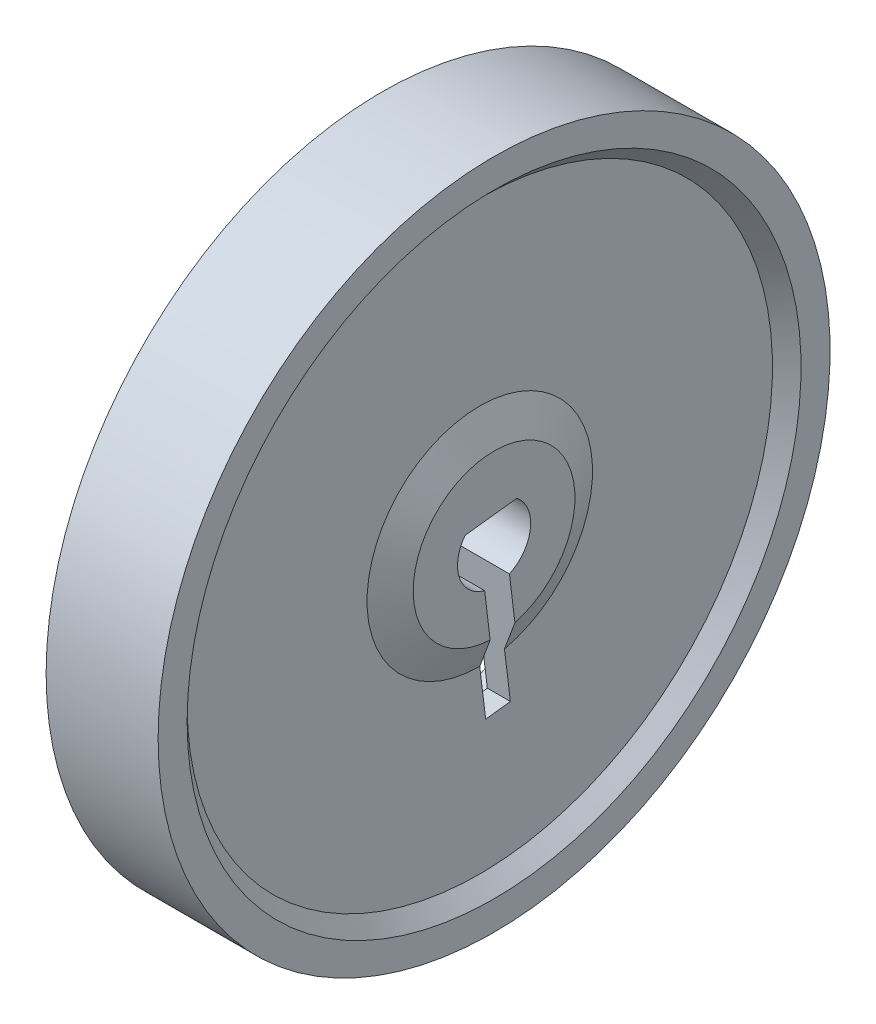
ISO-10303-21;
HEADER;
FILE_DESCRIPTION(('STEP AP214'),'2;1');
FILE_NAME('part.step','',(''),(''),'','','');
FILE_SCHEMA(('AUTOMOTIVE_DESIGN { 1 0 10303 214 1 1 1 1 }'));
ENDSEC;
DATA;
#1=APPLICATION_CONTEXT('core data for automotive mechanical design processes');
#2=APPLICATION_PROTOCOL_DEFINITION('international standard','automotive_design',2000,#1);
#3=PRODUCT_CONTEXT('',#1,'mechanical');
#4=PRODUCT('Part','Part','',(#3));
#5=PRODUCT_RELATED_PRODUCT_CATEGORY('part','',(#4));
#6=PRODUCT_DEFINITION_FORMATION('','',#4);
#7=PRODUCT_DEFINITION_CONTEXT('part definition',#1,'design');
#8=PRODUCT_DEFINITION('design','',#6,#7);
#9=PRODUCT_DEFINITION_SHAPE('','',#8);
#10=(LENGTH_UNIT() NAMED_UNIT(*) SI_UNIT(.MILLI.,.METRE.));
#11=(NAMED_UNIT(*) PLANE_ANGLE_UNIT() SI_UNIT($,.RADIAN.));
#12=(NAMED_UNIT(*) SI_UNIT($,.STERADIAN.) SOLID_ANGLE_UNIT());
#13=UNCERTAINTY_MEASURE_WITH_UNIT(LENGTH_MEASURE(1.E-05),#10,'distance_accuracy_value','');
#14=(GEOMETRIC_REPRESENTATION_CONTEXT(3) GLOBAL_UNCERTAINTY_ASSIGNED_CONTEXT((#13)) GLOBAL_UNIT_ASSIGNED_CONTEXT((#10,
#11,#12)) REPRESENTATION_CONTEXT('',''));
#15=CARTESIAN_POINT('',(0.,0.,0.));
#16=DIRECTION('',(0.,0.,1.));
#17=DIRECTION('',(1.,0.,0.));
#18=AXIS2_PLACEMENT_3D('',#15,#16,#17);
#19=CARTESIAN_POINT('',(-0.574918786767848,0.,0.));
#20=DIRECTION('',(1.,0.,0.));
#21=DIRECTION('',(0.,0.,-1.));
#22=AXIS2_PLACEMENT_3D('',#19,#20,#21);
#23=CONICAL_SURFACE('',#22,11.7591738452205,0.785398163397457);
#24=CARTESIAN_POINT('',(0.,0.,0.));
#25=DIRECTION('',(-1.,0.,0.));
#26=DIRECTION('',(0.,0.,1.));
#27=AXIS2_PLACEMENT_3D('',#24,#25,#26);
#28=CIRCLE('',#27,12.3340926319884);
#29=CARTESIAN_POINT('',(0.,0.,12.3340926319884));
#30=VERTEX_POINT('',#29);
#31=EDGE_CURVE('E196',#30,#30,#28,.T.);
#32=ORIENTED_EDGE('',*,*,#31,.F.);
#33=EDGE_LOOP('',(#32));
#34=FACE_BOUND('',#33,.T.);
#35=CARTESIAN_POINT('',(-0.574918786767848,0.,0.));
#36=DIRECTION('',(-1.,0.,0.));
#37=DIRECTION('',(0.,0.,1.));
#38=AXIS2_PLACEMENT_3D('',#35,#36,#37);
#39=CIRCLE('',#38,11.7591738452205);
#40=CARTESIAN_POINT('',(-0.574918786767848,0.,11.7591738452205));
#41=VERTEX_POINT('',#40);
#42=EDGE_CURVE('E198',#41,#41,#39,.T.);
#43=ORIENTED_EDGE('',*,*,#42,.T.);
#44=EDGE_LOOP('',(#43));
#45=FACE_BOUND('',#44,.T.);
#46=ADVANCED_FACE('F34',(#34,#45),#23,.F.);
#47=CARTESIAN_POINT('',(0.,12.3340926319884,0.));
#48=DIRECTION('',(-1.,0.,0.));
#49=DIRECTION('',(0.,0.,1.));
#50=AXIS2_PLACEMENT_3D('',#47,#48,#49);
#51=PLANE('',#50);
#52=CARTESIAN_POINT('',(0.,0.,0.));
#53=DIRECTION('',(-1.,0.,0.));
#54=DIRECTION('',(0.,0.,1.));
#55=AXIS2_PLACEMENT_3D('',#52,#53,#54);
#56=CIRCLE('',#55,13.5);
#57=CARTESIAN_POINT('',(0.,0.,13.5));
#58=VERTEX_POINT('',#57);
#59=EDGE_CURVE('E226',#58,#58,#56,.T.);
#60=ORIENTED_EDGE('',*,*,#59,.F.);
#61=EDGE_LOOP('',(#60));
#62=FACE_BOUND('',#61,.T.);
#63=ORIENTED_EDGE('',*,*,#31,.T.);
#64=EDGE_LOOP('',(#63));
#65=FACE_BOUND('',#64,.T.);
#66=ADVANCED_FACE('F186',(#62,#65),#51,.F.);
#67=CARTESIAN_POINT('',(-7.,0.,0.));
#68=DIRECTION('',(-1.,0.,0.));
#69=DIRECTION('',(0.,0.,1.));
#70=AXIS2_PLACEMENT_3D('',#67,#68,#69);
#71=CYLINDRICAL_SURFACE('',#70,13.5);
#72=CARTESIAN_POINT('',(-4.5,0.,0.));
#73=DIRECTION('',(-1.,0.,0.));
#74=DIRECTION('',(0.,0.,1.));
#75=AXIS2_PLACEMENT_3D('',#72,#73,#74);
#76=CIRCLE('',#75,13.5);
#77=CARTESIAN_POINT('',(-4.5,0.,13.5));
#78=VERTEX_POINT('',#77);
#79=EDGE_CURVE('E223',#78,#78,#76,.T.);
#80=ORIENTED_EDGE('',*,*,#79,.F.);
#81=EDGE_LOOP('',(#80));
#82=FACE_BOUND('',#81,.T.);
#83=ORIENTED_EDGE('',*,*,#59,.T.);
#84=EDGE_LOOP('',(#83));
#85=FACE_BOUND('',#84,.T.);
#86=ADVANCED_FACE('F191',(#82,#85),#71,.T.);
#87=CARTESIAN_POINT('',(-4.5,13.5,0.));
#88=DIRECTION('',(1.,0.,0.));
#89=DIRECTION('',(0.,0.,-1.));
#90=AXIS2_PLACEMENT_3D('',#87,#88,#89);
#91=PLANE('',#90);
#92=CARTESIAN_POINT('',(-4.5,0.,0.));
#93=DIRECTION('',(-1.,0.,0.));
#94=DIRECTION('',(0.,0.,1.));
#95=AXIS2_PLACEMENT_3D('',#92,#93,#94);
#96=CIRCLE('',#95,9.58354968555852);
#97=CARTESIAN_POINT('',(-4.5,0.,9.58354968555852));
#98=VERTEX_POINT('',#97);
#99=EDGE_CURVE('E220',#98,#98,#96,.T.);
#100=ORIENTED_EDGE('',*,*,#99,.F.);
#101=EDGE_LOOP('',(#100));
#102=FACE_BOUND('',#101,.T.);
#103=ORIENTED_EDGE('',*,*,#79,.T.);
#104=EDGE_LOOP('',(#103));
#105=FACE_BOUND('',#104,.T.);
#106=ADVANCED_FACE('F361',(#102,#105),#91,.F.);
#107=CARTESIAN_POINT('',(-7.,0.,0.));
#108=DIRECTION('',(-1.,0.,0.));
#109=DIRECTION('',(0.,0.,1.));
#110=AXIS2_PLACEMENT_3D('',#107,#108,#109);
#111=CYLINDRICAL_SURFACE('',#110,9.58354968555852);
#112=CARTESIAN_POINT('',(-1.5,0.,0.));
#113=DIRECTION('',(-1.,0.,0.));
#114=DIRECTION('',(0.,0.,1.));
#115=AXIS2_PLACEMENT_3D('',#112,#113,#114);
#116=CIRCLE('',#115,9.58354968555852);
#117=CARTESIAN_POINT('',(-1.5,0.,9.58354968555852));
#118=VERTEX_POINT('',#117);
#119=EDGE_CURVE('E217',#118,#118,#116,.T.);
#120=ORIENTED_EDGE('',*,*,#119,.F.);
#121=EDGE_LOOP('',(#120));
#122=FACE_BOUND('',#121,.T.);
#123=ORIENTED_EDGE('',*,*,#99,.T.);
#124=EDGE_LOOP('',(#123));
#125=FACE_BOUND('',#124,.T.);
#126=ADVANCED_FACE('F352',(#122,#125),#111,.F.);
#127=CARTESIAN_POINT('',(-1.5,9.58354968555852,0.));
#128=DIRECTION('',(1.,0.,0.));
#129=DIRECTION('',(0.,0.,-1.));
#130=AXIS2_PLACEMENT_3D('',#127,#128,#129);
#131=PLANE('',#130);
#132=DIRECTION('',(0.,0.120696838930207,-0.992689414203786));
#133=VECTOR('',#132,1.);
#134=CARTESIAN_POINT('',(-1.5,-6.28308997508079,-1.92915651570621));
#135=LINE('',#134,#133);
#136=CARTESIAN_POINT('',(-1.5,-6.48894000304826,-0.236111813889073));
#137=VERTEX_POINT('',#136);
#138=CARTESIAN_POINT('',(-1.5,-6.36824316411806,-1.22880122809286));
#139=VERTEX_POINT('',#138);
#140=EDGE_CURVE('E261',#137,#139,#135,.T.);
#141=ORIENTED_EDGE('',*,*,#140,.T.);
#142=DIRECTION('',(0.,0.992689414203786,0.120696838930207));
#143=VECTOR('',#142,1.);
#144=CARTESIAN_POINT('',(-1.5,9.49839649652126,0.70035528761336));
#145=LINE('',#144,#143);
#146=CARTESIAN_POINT('',(-1.5,-3.14054195489807,-0.836358911906251));
#147=VERTEX_POINT('',#146);
#148=EDGE_CURVE('E240',#139,#147,#145,.T.);
#149=ORIENTED_EDGE('',*,*,#148,.T.);
#150=CARTESIAN_POINT('',(-1.5,0.,0.));
#151=DIRECTION('',(-1.,0.,0.));
#152=DIRECTION('',(0.,0.,1.));
#153=AXIS2_PLACEMENT_3D('',#150,#151,#152);
#154=CIRCLE('',#153,3.25);
#155=CARTESIAN_POINT('',(-1.5,-3.24614906780128,0.158165197223985));
#156=VERTEX_POINT('',#155);
#157=EDGE_CURVE('E214',#156,#147,#154,.T.);
#158=ORIENTED_EDGE('',*,*,#157,.F.);
#159=DIRECTION('',(0.,-0.992689414203786,-0.120696838930207));
#160=VECTOR('',#159,1.);
#161=CARTESIAN_POINT('',(-1.5,9.37769965759105,1.69304470181714));
#162=LINE('',#161,#160);
#163=EDGE_CURVE('E258',#156,#137,#162,.T.);
#164=ORIENTED_EDGE('',*,*,#163,.T.);
#165=EDGE_LOOP('',(#141,#149,#158,#164));
#166=FACE_BOUND('',#165,.T.);
#167=ORIENTED_EDGE('',*,*,#119,.T.);
#168=EDGE_LOOP('',(#167));
#169=FACE_BOUND('',#168,.T.);
#170=ADVANCED_FACE('F343',(#166,#169),#131,.F.);
#171=CARTESIAN_POINT('',(-7.,0.,0.));
#172=DIRECTION('',(-1.,0.,0.));
#173=DIRECTION('',(0.,0.,1.));
#174=AXIS2_PLACEMENT_3D('',#171,#172,#173);
#175=CYLINDRICAL_SURFACE('',#174,3.25);
#176=ORIENTED_EDGE('',*,*,#157,.T.);
#177=DIRECTION('',(-1.,0.,0.));
#178=VECTOR('',#177,1.);
#179=CARTESIAN_POINT('',(-7.,-3.14054195489807,-0.836358911906251));
#180=LINE('',#179,#178);
#181=CARTESIAN_POINT('',(-7.,-3.14054195489807,-0.836358911906251));
#182=VERTEX_POINT('',#181);
#183=EDGE_CURVE('E242',#147,#182,#180,.T.);
#184=ORIENTED_EDGE('',*,*,#183,.T.);
#185=CARTESIAN_POINT('',(-7.,0.,0.));
#186=DIRECTION('',(-1.,0.,0.));
#187=DIRECTION('',(0.,0.,1.));
#188=AXIS2_PLACEMENT_3D('',#185,#186,#187);
#189=CIRCLE('',#188,3.25);
#190=CARTESIAN_POINT('',(-7.,-3.24614906780128,0.158165197223985));
#191=VERTEX_POINT('',#190);
#192=EDGE_CURVE('E211',#191,#182,#189,.T.);
#193=ORIENTED_EDGE('',*,*,#192,.F.);
#194=DIRECTION('',(-1.,0.,0.));
#195=VECTOR('',#194,1.);
#196=CARTESIAN_POINT('',(-7.,-3.24614906780128,0.158165197223985));
#197=LINE('',#196,#195);
#198=EDGE_CURVE('E257',#191,#156,#197,.F.);
#199=ORIENTED_EDGE('',*,*,#198,.T.);
#200=EDGE_LOOP('',(#176,#184,#193,#199));
#201=FACE_BOUND('',#200,.T.);
#202=ADVANCED_FACE('F334',(#201),#175,.T.);
#203=CARTESIAN_POINT('',(-7.,3.25,0.));
#204=DIRECTION('',(1.,0.,0.));
#205=DIRECTION('',(0.,0.,-1.));
#206=AXIS2_PLACEMENT_3D('',#203,#204,#205);
#207=PLANE('',#206);
#208=ORIENTED_EDGE('',*,*,#192,.T.);
#209=DIRECTION('',(0.,0.992689414203786,0.120696838930207));
#210=VECTOR('',#209,1.);
#211=CARTESIAN_POINT('',(-7.,3.25711223326525,-0.0584956386293218));
#212=LINE('',#211,#210);
#213=CARTESIAN_POINT('',(-7.,-1.33435968531845,-0.616752973381259));
#214=VERTEX_POINT('',#213);
#215=EDGE_CURVE('E247',#182,#214,#212,.T.);
#216=ORIENTED_EDGE('',*,*,#215,.T.);
#217=CARTESIAN_POINT('',(-7.,0.,0.));
#218=DIRECTION('',(1.,0.,0.));
#219=DIRECTION('',(0.,0.,-1.));
#220=AXIS2_PLACEMENT_3D('',#217,#218,#219);
#221=CIRCLE('',#220,1.46999999999245);
#222=CARTESIAN_POINT('',(-7.,1.14905800924481,-0.916823696993145));
#223=VERTEX_POINT('',#222);
#224=EDGE_CURVE('E200',#214,#223,#221,.T.);
#225=ORIENTED_EDGE('',*,*,#224,.T.);
#226=DIRECTION('',(0.,-0.120696838930206,0.992689414203786));
#227=VECTOR('',#226,1.);
#228=CARTESIAN_POINT('',(-7.,1.06981520914508,-0.26507929748698));
#229=LINE('',#228,#227);
#230=CARTESIAN_POINT('',(-7.,0.895882184015027,1.16545918518937));
#231=VERTEX_POINT('',#230);
#232=EDGE_CURVE('E115',#223,#231,#229,.T.);
#233=ORIENTED_EDGE('',*,*,#232,.T.);
#234=CARTESIAN_POINT('',(-7.,0.,0.));
#235=DIRECTION('',(1.,0.,0.));
#236=DIRECTION('',(0.,0.,-1.));
#237=AXIS2_PLACEMENT_3D('',#234,#235,#236);
#238=CIRCLE('',#237,1.46999999999245);
#239=CARTESIAN_POINT('',(-7.,-1.41998138786033,0.380201075890197));
#240=VERTEX_POINT('',#239);
#241=EDGE_CURVE('E205',#231,#240,#238,.T.);
#242=ORIENTED_EDGE('',*,*,#241,.T.);
#243=DIRECTION('',(0.,-0.992689414203786,-0.120696838930207));
#244=VECTOR('',#243,1.);
#245=CARTESIAN_POINT('',(-7.,3.13641539433504,0.934193775574461));
#246=LINE('',#245,#244);
#247=EDGE_CURVE('E155',#240,#191,#246,.T.);
#248=ORIENTED_EDGE('',*,*,#247,.T.);
#249=EDGE_LOOP('',(#208,#216,#225,#233,#242,#248));
#250=FACE_BOUND('',#249,.T.);
#251=ADVANCED_FACE('F253',(#250),#207,.F.);
#252=CARTESIAN_POINT('',(0.,3.25,0.));
#253=DIRECTION('',(-1.,0.,0.));
#254=DIRECTION('',(0.,0.,1.));
#255=AXIS2_PLACEMENT_3D('',#252,#253,#254);
#256=PLANE('',#255);
#257=CARTESIAN_POINT('',(0.,0.,0.));
#258=DIRECTION('',(1.,0.,0.));
#259=DIRECTION('',(0.,0.,-1.));
#260=AXIS2_PLACEMENT_3D('',#257,#258,#259);
#261=CIRCLE('',#260,1.46999999999245);
#262=CARTESIAN_POINT('',(0.,-1.33435968531845,-0.616752973381259));
#263=VERTEX_POINT('',#262);
#264=CARTESIAN_POINT('',(0.,1.14905800924481,-0.916823696993145));
#265=VERTEX_POINT('',#264);
#266=EDGE_CURVE('E121',#263,#265,#261,.T.);
#267=ORIENTED_EDGE('',*,*,#266,.F.);
#268=DIRECTION('',(0.,0.992689414203786,0.120696838930207));
#269=VECTOR('',#268,1.);
#270=CARTESIAN_POINT('',(0.,-6.36824316411806,-1.22880122809286));
#271=LINE('',#270,#269);
#272=CARTESIAN_POINT('',(0.,-3.14054195489807,-0.836358911906251));
#273=VERTEX_POINT('',#272);
#274=EDGE_CURVE('E118',#273,#263,#271,.T.);
#275=ORIENTED_EDGE('',*,*,#274,.F.);
#276=CARTESIAN_POINT('',(0.,0.,0.));
#277=DIRECTION('',(-1.,0.,0.));
#278=DIRECTION('',(0.,0.,1.));
#279=AXIS2_PLACEMENT_3D('',#276,#277,#278);
#280=CIRCLE('',#279,3.25);
#281=CARTESIAN_POINT('',(0.,-3.24614906780127,0.158165197223986));
#282=VERTEX_POINT('',#281);
#283=EDGE_CURVE('E203',#282,#273,#280,.T.);
#284=ORIENTED_EDGE('',*,*,#283,.F.);
#285=DIRECTION('',(0.,-0.992689414203786,-0.120696838930207));
#286=VECTOR('',#285,1.);
#287=CARTESIAN_POINT('',(0.,-1.41998138786032,0.380201075890196));
#288=LINE('',#287,#286);
#289=CARTESIAN_POINT('',(0.,-1.41998138786033,0.380201075890197));
#290=VERTEX_POINT('',#289);
#291=EDGE_CURVE('E134',#290,#282,#288,.T.);
#292=ORIENTED_EDGE('',*,*,#291,.F.);
#293=CARTESIAN_POINT('',(0.,0.,0.));
#294=DIRECTION('',(1.,0.,0.));
#295=DIRECTION('',(0.,0.,-1.));
#296=AXIS2_PLACEMENT_3D('',#293,#294,#295);
#297=CIRCLE('',#296,1.46999999999245);
#298=CARTESIAN_POINT('',(0.,0.895882184015027,1.16545918518937));
#299=VERTEX_POINT('',#298);
#300=EDGE_CURVE('E132',#299,#290,#297,.T.);
#301=ORIENTED_EDGE('',*,*,#300,.F.);
#302=DIRECTION('',(0.,-0.120696838930206,0.992689414203786));
#303=VECTOR('',#302,1.);
#304=CARTESIAN_POINT('',(0.,0.943554298087325,0.773372669819648));
#305=LINE('',#304,#303);
#306=EDGE_CURVE('E112',#265,#299,#305,.T.);
#307=ORIENTED_EDGE('',*,*,#306,.F.);
#308=EDGE_LOOP('',(#267,#275,#284,#292,#301,#307));
#309=FACE_BOUND('',#308,.T.);
#310=ADVANCED_FACE('F129',(#309),#256,.F.);
#311=CARTESIAN_POINT('',(0.,0.,0.));
#312=DIRECTION('',(-1.,0.,0.));
#313=DIRECTION('',(0.,0.,1.));
#314=AXIS2_PLACEMENT_3D('',#311,#312,#313);
#315=CONICAL_SURFACE('',#314,3.25,1.14873345105707);
#316=ORIENTED_EDGE('',*,*,#283,.T.);
#317=CARTESIAN_POINT('',(1.12287219187503,0.648491865808977,-0.375666576302173));
#318=CARTESIAN_POINT('',(1.13041008459485,0.62761614499144,-0.37820476546488));
#319=CARTESIAN_POINT('',(1.13782465407268,0.606696778498657,-0.380748261317636));
#320=CARTESIAN_POINT('',(1.15233474340229,0.564743501635109,-0.385849179920918));
#321=CARTESIAN_POINT('',(1.15943018099028,0.543709563279549,-0.388406606073997));
#322=CARTESIAN_POINT('',(1.18022301500979,0.4801063725195,-0.396139844648693));
#323=CARTESIAN_POINT('',(1.19331586080381,0.437336643397499,-0.40134003217267));
#324=CARTESIAN_POINT('',(1.21638299180983,0.352965376252149,-0.411598371886252));
#325=CARTESIAN_POINT('',(1.22646873430301,0.311394699300939,-0.416652771810749));
#326=CARTESIAN_POINT('',(1.24285328023929,0.227599513297385,-0.426841068294508));
#327=CARTESIAN_POINT('',(1.24916368355708,0.18537742017045,-0.431974671111786));
#328=CARTESIAN_POINT('',(1.25483389749344,0.120746870917812,-0.439832821789632));
#329=CARTESIAN_POINT('',(1.25607357664895,0.0984992538567768,-0.442537813919673));
#330=CARTESIAN_POINT('',(1.25705287644826,0.0539719737685256,-0.447951694511039));
#331=CARTESIAN_POINT('',(1.25679255530771,0.0316923120185287,-0.450660582817071));
#332=CARTESIAN_POINT('',(1.25375960283885,-0.0350789250760284,-0.458779010528156));
#333=CARTESIAN_POINT('',(1.24873270700475,-0.0794771876921573,-0.464177204439651));
#334=CARTESIAN_POINT('',(1.23400479555438,-0.167851817877902,-0.474922295857394));
#335=CARTESIAN_POINT('',(1.22426080038247,-0.211820436787686,-0.4802682512374));
#336=CARTESIAN_POINT('',(1.20181864505729,-0.299011867913902,-0.490869482567318));
#337=CARTESIAN_POINT('',(1.18911832009603,-0.342234108551109,-0.496124689021369));
#338=CARTESIAN_POINT('',(1.16413227162441,-0.42107684589763,-0.505710838560358));
#339=CARTESIAN_POINT('',(1.15211850758353,-0.456784383113913,-0.510052364526408));
#340=CARTESIAN_POINT('',(1.12722869243198,-0.527903780511457,-0.518699466358747));
#341=CARTESIAN_POINT('',(1.11435256330922,-0.563315613615667,-0.523005038932854));
#342=CARTESIAN_POINT('',(1.07484039685275,-0.669256490579048,-0.535885934790124));
#343=CARTESIAN_POINT('',(1.04733026138743,-0.739462089563255,-0.544421931801226));
#344=CARTESIAN_POINT('',(0.991108735532943,-0.879426376224421,-0.561439587798569));
#345=CARTESIAN_POINT('',(0.962396808838778,-0.949184848006108,-0.569921220535033));
#346=CARTESIAN_POINT('',(0.904280713192798,-1.08839697994193,-0.586847425272357));
#347=CARTESIAN_POINT('',(0.874876713644552,-1.15785070985169,-0.595292005754506));
#348=CARTESIAN_POINT('',(0.815582522229644,-1.29669948866695,-0.612174031947727));
#349=CARTESIAN_POINT('',(0.785691553462608,-1.3660942093271,-0.620611437748858));
#350=CARTESIAN_POINT('',(0.725618172325819,-1.50476431135167,-0.637471739399117));
#351=CARTESIAN_POINT('',(0.695435741694547,-1.57403968491373,-0.64589463429959));
#352=CARTESIAN_POINT('',(0.60462390510213,-1.78166809788482,-0.671139280569749));
#353=CARTESIAN_POINT('',(0.543699608474888,-1.91989389755621,-0.68794556140666));
#354=CARTESIAN_POINT('',(0.399860421513109,-2.24493436676205,-0.727465834914364));
#355=CARTESIAN_POINT('',(0.316775443664136,-2.43167468599004,-0.75017078765098));
#356=CARTESIAN_POINT('',(0.150222186532067,-2.80498853977587,-0.79556041449307));
#357=CARTESIAN_POINT('',(0.06675390396682,-2.99156207288915,-0.818245088422907));
#358=CARTESIAN_POINT('',(-0.184008084629733,-3.55121904277443,-0.886291373780539));
#359=CARTESIAN_POINT('',(-0.35162389759481,-3.92416017679611,-0.931635683228593));
#360=CARTESIAN_POINT('',(-0.685682961568016,-4.66652931856109,-1.02189715620122));
#361=CARTESIAN_POINT('',(-0.852123157936105,-5.03595868272625,-1.06681448464729));
#362=CARTESIAN_POINT('',(-1.18516259660868,-5.77464776618692,-1.15662851514893));
#363=CARTESIAN_POINT('',(-1.3517617951033,-6.14390750494323,-1.20152521957065));
#364=CARTESIAN_POINT('',(-1.518390126134,-6.51315427641308,-1.24642034735575));
#365=B_SPLINE_CURVE_WITH_KNOTS('',3,(#317,#318,#319,#320,#321,#322,#323,#324,#325,#326,#327,
#328,#329,#330,#331,#332,#333,#334,#335,#336,#337,#338,#339,#340,#341,#342,#343,#344,#345,#346,
#347,#348,#349,#350,#351,#352,#353,#354,#355,#356,#357,#358,#359,#360,#361,#362,#363,#364),
.UNSPECIFIED.,.F.,.F.,(4,2,2,2,2,2,2,2,2,2,2,2,2,2,2,2,2,2,2,2,2,2,2,4),(0.,0.067017376958419,
0.134051931365432,0.269089091788341,0.398212845912588,0.526937797174617,0.594228299942717,
0.661516191155212,0.796168860736941,0.93207218390382,1.06807533872186,1.18183330135043,
1.29560156879745,1.52322986491229,1.75096084743409,1.97863665473367,2.20672049758372,
2.43481872494635,2.89078358045612,3.50772303641258,4.12466778496899,5.35881723374591,
6.58183874951649,7.80458718705884),.UNSPECIFIED.);
#366=CARTESIAN_POINT('',(-0.574918786767848,-4.42036690843555,-0.991967326850286));
#367=VERTEX_POINT('',#366);
#368=EDGE_CURVE('E265',#273,#367,#365,.T.);
#369=ORIENTED_EDGE('',*,*,#368,.T.);
#370=CARTESIAN_POINT('',(-0.574918786767848,0.,0.));
#371=DIRECTION('',(-1.,0.,0.));
#372=DIRECTION('',(0.,0.,1.));
#373=AXIS2_PLACEMENT_3D('',#370,#371,#372);
#374=CIRCLE('',#373,4.53030272528565);
#375=CARTESIAN_POINT('',(-0.574918786767848,-4.53030227023343,0.00203052910124717));
#376=VERTEX_POINT('',#375);
#377=EDGE_CURVE('E199',#376,#367,#374,.T.);
#378=ORIENTED_EDGE('',*,*,#377,.F.);
#379=CARTESIAN_POINT('',(-1.4451299807469,-6.46399953783818,-0.233079409927436));
#380=CARTESIAN_POINT('',(-1.28185834443338,-6.10170289442545,-0.189029318338604));
#381=CARTESIAN_POINT('',(-1.11863072794929,-5.7393867051657,-0.144976850254248));
#382=CARTESIAN_POINT('',(-0.792452055410273,-5.01456327534735,-0.0568486849793169));
#383=CARTESIAN_POINT('',(-0.629501046946772,-4.65205601368961,-0.0127729852233883));
#384=CARTESIAN_POINT('',(-0.304859792892945,-3.92847108559555,0.0752045959504202));
#385=CARTESIAN_POINT('',(-0.143167189714417,-3.56739446409509,0.11910635031904));
#386=CARTESIAN_POINT('',(0.0983954964695896,-3.0253801697045,0.185007538597957));
#387=CARTESIAN_POINT('',(0.178748232774123,-2.84465453786523,0.206981191348309));
#388=CARTESIAN_POINT('',(0.338889793216437,-2.48295778979965,0.25095834424045));
#389=CARTESIAN_POINT('',(0.418678620940707,-2.30198667514337,0.272961844191348));
#390=CARTESIAN_POINT('',(0.550379646439713,-2.00076562561811,0.309586016844683));
#391=CARTESIAN_POINT('',(0.602605478535234,-1.88065088788638,0.324190251508332));
#392=CARTESIAN_POINT('',(0.70623725739734,-1.64003024688991,0.353446280971411));
#393=CARTESIAN_POINT('',(0.757642964786137,-1.51952424134204,0.368098088207011));
#394=CARTESIAN_POINT('',(0.833647273407562,-1.3379857692317,0.390170570712037));
#395=CARTESIAN_POINT('',(0.858853768802723,-1.27720463023622,0.397560688142891));
#396=CARTESIAN_POINT('',(0.908652806058024,-1.15539554335487,0.412370931436707));
#397=CARTESIAN_POINT('',(0.933245361937148,-1.09436760114167,0.419791056609954));
#398=CARTESIAN_POINT('',(0.981484765863884,-0.971966960202536,0.43467322441894));
#399=CARTESIAN_POINT('',(1.00513193707665,-0.91059438760776,0.442135251718934));
#400=CARTESIAN_POINT('',(1.05091476986971,-0.78730021246144,0.457126060511435));
#401=CARTESIAN_POINT('',(1.0730507045601,-0.725378711409568,0.464654829663031));
#402=CARTESIAN_POINT('',(1.11065716208666,-0.6128015118232,0.478342607462685));
#403=CARTESIAN_POINT('',(1.12658635262249,-0.562299404573028,0.484482941606672));
#404=CARTESIAN_POINT('',(1.15573408025363,-0.460485566856103,0.496862048501493));
#405=CARTESIAN_POINT('',(1.16895138521268,-0.409173479729636,0.503100864617049));
#406=CARTESIAN_POINT('',(1.19090092866643,-0.306133979981962,0.515628994489844));
#407=CARTESIAN_POINT('',(1.19968093288531,-0.254417355488937,0.521916996564949));
#408=CARTESIAN_POINT('',(1.20824028029636,-0.176390382024757,0.531403960879937));
#409=CARTESIAN_POINT('',(1.21032513758556,-0.150328892209906,0.534572665404693));
#410=CARTESIAN_POINT('',(1.21282548303157,-0.098128425656335,0.540919495756209));
#411=CARTESIAN_POINT('',(1.21324111271329,-0.0719894556748055,0.544097620761393));
#412=CARTESIAN_POINT('',(1.21199788306489,0.000843019360570369,0.55295300834028));
#413=CARTESIAN_POINT('',(1.20844767834903,0.0475135043344501,0.55862747200141));
#414=CARTESIAN_POINT('',(1.19662499083894,0.140365486105418,0.569916945353102));
#415=CARTESIAN_POINT('',(1.18833717486364,0.18654489680808,0.575531701404411));
#416=CARTESIAN_POINT('',(1.16799467820241,0.280130188842101,0.586910334798952));
#417=CARTESIAN_POINT('',(1.15579334371506,0.327503420171934,0.59267024236884));
#418=CARTESIAN_POINT('',(1.13576434795322,0.397887630238177,0.601227955933671));
#419=CARTESIAN_POINT('',(1.12882682532427,0.421157977151311,0.604057297390361));
#420=CARTESIAN_POINT('',(1.11447689604358,0.467544090730076,0.609697185555891));
#421=CARTESIAN_POINT('',(1.1070646811689,0.490659915706404,0.612507739354477));
#422=CARTESIAN_POINT('',(1.09946622684421,0.513715424692202,0.615310959591035));
#423=B_SPLINE_CURVE_WITH_KNOTS('',3,(#379,#380,#381,#382,#383,#384,#385,#386,#387,#388,#389,
#390,#391,#392,#393,#394,#395,#396,#397,#398,#399,#400,#401,#402,#403,#404,#405,#406,#407,#408,
#409,#410,#411,#412,#413,#414,#415,#416,#417,#418,#419,#420,#421,#422),.UNSPECIFIED.,.F.,.F.,(4,
2,2,2,2,2,2,2,2,2,2,2,2,2,2,2,2,2,2,2,2,4),(0.,1.19946315692435,2.39911517115758,
3.59328015676235,4.19028108642378,4.78727821570492,5.18264456779092,5.57812428251199,
5.77676502767829,5.97540123283164,6.17396894633225,6.37250067923352,6.53238265466552,
6.69233711186604,6.85053095311621,6.92949077452978,7.00844390121956,7.14957058844986,
7.29115663645285,7.4388310138904,7.51216822793075,7.5854759981808),.UNSPECIFIED.);
#424=EDGE_CURVE('E56',#376,#282,#423,.T.);
#425=ORIENTED_EDGE('',*,*,#424,.T.);
#426=EDGE_LOOP('',(#316,#369,#378,#425));
#427=FACE_BOUND('',#426,.T.);
#428=ADVANCED_FACE('F157',(#427),#315,.T.);
#429=CARTESIAN_POINT('',(-0.574918786767848,11.7591738452205,0.));
#430=DIRECTION('',(-1.,0.,0.));
#431=DIRECTION('',(0.,0.,1.));
#432=AXIS2_PLACEMENT_3D('',#429,#430,#431);
#433=PLANE('',#432);
#434=ORIENTED_EDGE('',*,*,#42,.F.);
#435=EDGE_LOOP('',(#434));
#436=FACE_BOUND('',#435,.T.);
#437=ORIENTED_EDGE('',*,*,#377,.T.);
#438=DIRECTION('',(0.,-0.992689414203786,-0.120696838930207));
#439=VECTOR('',#438,1.);
#440=CARTESIAN_POINT('',(-0.574918786767848,11.6423267575279,0.961026552651342));
#441=LINE('',#440,#439);
#442=CARTESIAN_POINT('',(-0.574918786767848,-6.36824316411806,-1.22880122809286));
#443=VERTEX_POINT('',#442);
#444=EDGE_CURVE('E11',#367,#443,#441,.T.);
#445=ORIENTED_EDGE('',*,*,#444,.T.);
#446=DIRECTION('',(0.,-0.120696838930207,0.992689414203786));
#447=VECTOR('',#446,1.);
#448=CARTESIAN_POINT('',(-0.574918786767848,-6.25139607642543,-2.18982778074419));
#449=LINE('',#448,#447);
#450=CARTESIAN_POINT('',(-0.574918786767848,-6.48894000304826,-0.236111813889073));
#451=VERTEX_POINT('',#450);
#452=EDGE_CURVE('E41',#443,#451,#449,.T.);
#453=ORIENTED_EDGE('',*,*,#452,.T.);
#454=DIRECTION('',(0.,0.992689414203786,0.120696838930207));
#455=VECTOR('',#454,1.);
#456=CARTESIAN_POINT('',(-0.574918786767848,11.5216299185977,1.95371596685512));
#457=LINE('',#456,#455);
#458=EDGE_CURVE('E230',#451,#376,#457,.T.);
#459=ORIENTED_EDGE('',*,*,#458,.T.);
#460=EDGE_LOOP('',(#437,#445,#453,#459));
#461=FACE_BOUND('',#460,.T.);
#462=ADVANCED_FACE('F176',(#436,#461),#433,.F.);
#463=CARTESIAN_POINT('',(-10.,0.,0.));
#464=DIRECTION('',(1.,0.,0.));
#465=DIRECTION('',(0.,0.,-1.));
#466=AXIS2_PLACEMENT_3D('',#463,#464,#465);
#467=CYLINDRICAL_SURFACE('',#466,1.46999999999245);
#468=DIRECTION('',(1.,0.,0.));
#469=VECTOR('',#468,1.);
#470=CARTESIAN_POINT('',(-10.,-1.33435968531845,-0.616752973381259));
#471=LINE('',#470,#469);
#472=EDGE_CURVE('E124',#214,#263,#471,.T.);
#473=ORIENTED_EDGE('',*,*,#472,.T.);
#474=ORIENTED_EDGE('',*,*,#266,.T.);
#475=DIRECTION('',(1.,0.,0.));
#476=VECTOR('',#475,1.);
#477=CARTESIAN_POINT('',(-10.,1.14905800924481,-0.916823696993145));
#478=LINE('',#477,#476);
#479=EDGE_CURVE('E108',#223,#265,#478,.T.);
#480=ORIENTED_EDGE('',*,*,#479,.F.);
#481=ORIENTED_EDGE('',*,*,#224,.F.);
#482=EDGE_LOOP('',(#473,#474,#480,#481));
#483=FACE_BOUND('',#482,.T.);
#484=ADVANCED_FACE('F122',(#483),#467,.F.);
#485=CARTESIAN_POINT('',(-10.,0.,0.));
#486=DIRECTION('',(1.,0.,0.));
#487=DIRECTION('',(0.,0.,-1.));
#488=AXIS2_PLACEMENT_3D('',#485,#486,#487);
#489=CYLINDRICAL_SURFACE('',#488,1.46999999999245);
#490=DIRECTION('',(1.,0.,0.));
#491=VECTOR('',#490,1.);
#492=CARTESIAN_POINT('',(-10.,0.895882184015027,1.16545918518937));
#493=LINE('',#492,#491);
#494=EDGE_CURVE('E48',#231,#299,#493,.T.);
#495=ORIENTED_EDGE('',*,*,#494,.T.);
#496=ORIENTED_EDGE('',*,*,#300,.T.);
#497=DIRECTION('',(1.,0.,0.));
#498=VECTOR('',#497,1.);
#499=CARTESIAN_POINT('',(-10.,-1.41998138786033,0.380201075890197));
#500=LINE('',#499,#498);
#501=EDGE_CURVE('E146',#240,#290,#500,.T.);
#502=ORIENTED_EDGE('',*,*,#501,.F.);
#503=ORIENTED_EDGE('',*,*,#241,.F.);
#504=EDGE_LOOP('',(#495,#496,#502,#503));
#505=FACE_BOUND('',#504,.T.);
#506=ADVANCED_FACE('F168',(#505),#489,.F.);
#507=CARTESIAN_POINT('',(-10.,0.943554298087325,0.773372669819648));
#508=DIRECTION('',(0.,0.992689414203786,0.120696838930206));
#509=DIRECTION('',(0.,-0.120696838930206,0.992689414203786));
#510=AXIS2_PLACEMENT_3D('',#507,#508,#509);
#511=PLANE('',#510);
#512=ORIENTED_EDGE('',*,*,#479,.T.);
#513=ORIENTED_EDGE('',*,*,#306,.T.);
#514=ORIENTED_EDGE('',*,*,#494,.F.);
#515=ORIENTED_EDGE('',*,*,#232,.F.);
#516=EDGE_LOOP('',(#512,#513,#514,#515));
#517=FACE_BOUND('',#516,.T.);
#518=ADVANCED_FACE('F110',(#517),#511,.F.);
#519=CARTESIAN_POINT('',(-10.,-6.36824316411806,-1.22880122809286));
#520=DIRECTION('',(0.,0.120696838930207,-0.992689414203786));
#521=DIRECTION('',(0.,0.992689414203786,0.120696838930207));
#522=AXIS2_PLACEMENT_3D('',#519,#520,#521);
#523=PLANE('',#522);
#524=DIRECTION('',(1.,0.,0.));
#525=VECTOR('',#524,1.);
#526=CARTESIAN_POINT('',(-10.,-6.36824316411806,-1.22880122809286));
#527=LINE('',#526,#525);
#528=EDGE_CURVE('E140',#139,#443,#527,.T.);
#529=ORIENTED_EDGE('',*,*,#528,.T.);
#530=ORIENTED_EDGE('',*,*,#444,.F.);
#531=ORIENTED_EDGE('',*,*,#368,.F.);
#532=ORIENTED_EDGE('',*,*,#274,.T.);
#533=ORIENTED_EDGE('',*,*,#472,.F.);
#534=ORIENTED_EDGE('',*,*,#215,.F.);
#535=ORIENTED_EDGE('',*,*,#183,.F.);
#536=ORIENTED_EDGE('',*,*,#148,.F.);
#537=EDGE_LOOP('',(#529,#530,#531,#532,#533,#534,#535,#536));
#538=FACE_BOUND('',#537,.T.);
#539=ADVANCED_FACE('F174',(#538),#523,.F.);
#540=CARTESIAN_POINT('',(-10.,-6.48894000304826,-0.236111813889073));
#541=DIRECTION('',(0.,-0.992689414203786,-0.120696838930207));
#542=DIRECTION('',(0.,0.120696838930207,-0.992689414203786));
#543=AXIS2_PLACEMENT_3D('',#540,#541,#542);
#544=PLANE('',#543);
#545=DIRECTION('',(1.,0.,0.));
#546=VECTOR('',#545,1.);
#547=CARTESIAN_POINT('',(-10.,-6.48894000304826,-0.236111813889073));
#548=LINE('',#547,#546);
#549=EDGE_CURVE('E143',#137,#451,#548,.T.);
#550=ORIENTED_EDGE('',*,*,#549,.T.);
#551=ORIENTED_EDGE('',*,*,#452,.F.);
#552=ORIENTED_EDGE('',*,*,#528,.F.);
#553=ORIENTED_EDGE('',*,*,#140,.F.);
#554=EDGE_LOOP('',(#550,#551,#552,#553));
#555=FACE_BOUND('',#554,.T.);
#556=ADVANCED_FACE('F166',(#555),#544,.F.);
#557=CARTESIAN_POINT('',(-10.,-1.41998138786032,0.380201075890196));
#558=DIRECTION('',(0.,-0.120696838930207,0.992689414203786));
#559=DIRECTION('',(0.,-0.992689414203786,-0.120696838930207));
#560=AXIS2_PLACEMENT_3D('',#557,#558,#559);
#561=PLANE('',#560);
#562=ORIENTED_EDGE('',*,*,#198,.F.);
#563=ORIENTED_EDGE('',*,*,#247,.F.);
#564=ORIENTED_EDGE('',*,*,#501,.T.);
#565=ORIENTED_EDGE('',*,*,#291,.T.);
#566=ORIENTED_EDGE('',*,*,#424,.F.);
#567=ORIENTED_EDGE('',*,*,#458,.F.);
#568=ORIENTED_EDGE('',*,*,#549,.F.);
#569=ORIENTED_EDGE('',*,*,#163,.F.);
#570=EDGE_LOOP('',(#562,#563,#564,#565,#566,#567,#568,#569));
#571=FACE_BOUND('',#570,.T.);
#572=ADVANCED_FACE('F161',(#571),#561,.F.);
#573=CLOSED_SHELL('',(#46,#66,#86,#106,#126,#170,#202,#251,#310,#428,#462,#484,#506,#518,#539,
#556,#572));
#574=MANIFOLD_SOLID_BREP('B2',#573);
#575=ADVANCED_BREP_SHAPE_REPRESENTATION('',(#18,#574),#14);
#576=SHAPE_DEFINITION_REPRESENTATION(#9,#575);
ENDSEC;
END-ISO-10303-21;
